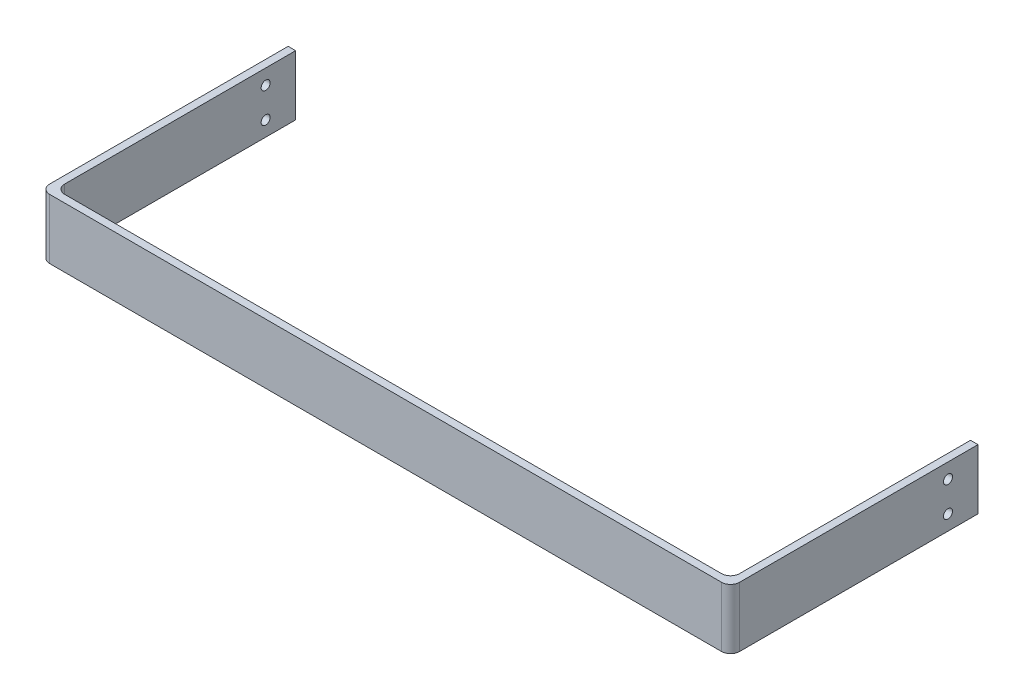
ISO-10303-21;
HEADER;
FILE_DESCRIPTION(('STEP AP214'),'2;1');
FILE_NAME('part.step','',(''),(''),'','','');
FILE_SCHEMA(('AUTOMOTIVE_DESIGN { 1 0 10303 214 1 1 1 1 }'));
ENDSEC;
DATA;
#1=APPLICATION_CONTEXT('core data for automotive mechanical design processes');
#2=APPLICATION_PROTOCOL_DEFINITION('international standard','automotive_design',2000,#1);
#3=PRODUCT_CONTEXT('',#1,'mechanical');
#4=PRODUCT('Part','Part','',(#3));
#5=PRODUCT_RELATED_PRODUCT_CATEGORY('part','',(#4));
#6=PRODUCT_DEFINITION_FORMATION('','',#4);
#7=PRODUCT_DEFINITION_CONTEXT('part definition',#1,'design');
#8=PRODUCT_DEFINITION('design','',#6,#7);
#9=PRODUCT_DEFINITION_SHAPE('','',#8);
#10=(LENGTH_UNIT() NAMED_UNIT(*) SI_UNIT(.MILLI.,.METRE.));
#11=(NAMED_UNIT(*) PLANE_ANGLE_UNIT() SI_UNIT($,.RADIAN.));
#12=(NAMED_UNIT(*) SI_UNIT($,.STERADIAN.) SOLID_ANGLE_UNIT());
#13=UNCERTAINTY_MEASURE_WITH_UNIT(LENGTH_MEASURE(1.E-05),#10,'distance_accuracy_value','');
#14=(GEOMETRIC_REPRESENTATION_CONTEXT(3) GLOBAL_UNCERTAINTY_ASSIGNED_CONTEXT((#13)) GLOBAL_UNIT_ASSIGNED_CONTEXT((#10,
#11,#12)) REPRESENTATION_CONTEXT('',''));
#15=CARTESIAN_POINT('',(0.,0.,0.));
#16=DIRECTION('',(0.,0.,1.));
#17=DIRECTION('',(1.,0.,0.));
#18=AXIS2_PLACEMENT_3D('',#15,#16,#17);
#19=CARTESIAN_POINT('',(227.5,20.,0.));
#20=DIRECTION('',(-1.,0.,0.));
#21=DIRECTION('',(0.,0.,1.));
#22=AXIS2_PLACEMENT_3D('',#19,#20,#21);
#23=PLANE('',#22);
#24=CARTESIAN_POINT('',(227.5,15.,-70.));
#25=DIRECTION('',(-1.,0.,0.));
#26=DIRECTION('',(0.,0.,1.));
#27=AXIS2_PLACEMENT_3D('',#24,#25,#26);
#28=CIRCLE('',#27,1.5);
#29=CARTESIAN_POINT('',(227.5,15.,-68.5));
#30=VERTEX_POINT('',#29);
#31=EDGE_CURVE('E171',#30,#30,#28,.F.);
#32=ORIENTED_EDGE('',*,*,#31,.F.);
#33=EDGE_LOOP('',(#32));
#34=FACE_BOUND('',#33,.T.);
#35=DIRECTION('',(0.,0.,-1.));
#36=VECTOR('',#35,1.);
#37=CARTESIAN_POINT('',(227.5,20.,0.));
#38=LINE('',#37,#36);
#39=CARTESIAN_POINT('',(227.5,20.,-0.5));
#40=VERTEX_POINT('',#39);
#41=CARTESIAN_POINT('',(227.5,20.,-80.));
#42=VERTEX_POINT('',#41);
#43=EDGE_CURVE('E123',#40,#42,#38,.T.);
#44=ORIENTED_EDGE('',*,*,#43,.F.);
#45=DIRECTION('',(0.,-1.,0.));
#46=VECTOR('',#45,1.);
#47=CARTESIAN_POINT('',(227.5,20.,-0.5));
#48=LINE('',#47,#46);
#49=CARTESIAN_POINT('',(227.5,0.,-0.5));
#50=VERTEX_POINT('',#49);
#51=EDGE_CURVE('E198',#40,#50,#48,.T.);
#52=ORIENTED_EDGE('',*,*,#51,.T.);
#53=DIRECTION('',(0.,0.,-1.));
#54=VECTOR('',#53,1.);
#55=CARTESIAN_POINT('',(227.5,0.,0.));
#56=LINE('',#55,#54);
#57=CARTESIAN_POINT('',(227.5,0.,-80.));
#58=VERTEX_POINT('',#57);
#59=EDGE_CURVE('E141',#50,#58,#56,.T.);
#60=ORIENTED_EDGE('',*,*,#59,.T.);
#61=DIRECTION('',(0.,-1.,0.));
#62=VECTOR('',#61,1.);
#63=CARTESIAN_POINT('',(227.5,20.,-80.));
#64=LINE('',#63,#62);
#65=EDGE_CURVE('E138',#42,#58,#64,.T.);
#66=ORIENTED_EDGE('',*,*,#65,.F.);
#67=EDGE_LOOP('',(#44,#52,#60,#66));
#68=FACE_BOUND('',#67,.T.);
#69=CARTESIAN_POINT('',(227.5,5.,-70.));
#70=DIRECTION('',(-1.,0.,0.));
#71=DIRECTION('',(0.,0.,1.));
#72=AXIS2_PLACEMENT_3D('',#69,#70,#71);
#73=CIRCLE('',#72,1.5);
#74=CARTESIAN_POINT('',(227.5,5.,-68.5));
#75=VERTEX_POINT('',#74);
#76=EDGE_CURVE('E316',#75,#75,#73,.F.);
#77=ORIENTED_EDGE('',*,*,#76,.F.);
#78=EDGE_LOOP('',(#77));
#79=FACE_BOUND('',#78,.T.);
#80=ADVANCED_FACE('F33',(#34,#68,#79),#23,.F.);
#81=CARTESIAN_POINT('',(225.,20.,0.));
#82=DIRECTION('',(-1.,0.,0.));
#83=DIRECTION('',(0.,0.,1.));
#84=AXIS2_PLACEMENT_3D('',#81,#82,#83);
#85=PLANE('',#84);
#86=CARTESIAN_POINT('',(225.,15.,-70.));
#87=DIRECTION('',(-1.,0.,0.));
#88=DIRECTION('',(0.,0.,1.));
#89=AXIS2_PLACEMENT_3D('',#86,#87,#88);
#90=CIRCLE('',#89,1.5);
#91=CARTESIAN_POINT('',(225.,15.,-68.5));
#92=VERTEX_POINT('',#91);
#93=EDGE_CURVE('E325',#92,#92,#90,.F.);
#94=ORIENTED_EDGE('',*,*,#93,.T.);
#95=EDGE_LOOP('',(#94));
#96=FACE_BOUND('',#95,.T.);
#97=DIRECTION('',(0.,0.,-1.));
#98=VECTOR('',#97,1.);
#99=CARTESIAN_POINT('',(225.,0.,0.));
#100=LINE('',#99,#98);
#101=CARTESIAN_POINT('',(225.,0.,-3.));
#102=VERTEX_POINT('',#101);
#103=CARTESIAN_POINT('',(225.,0.,-80.));
#104=VERTEX_POINT('',#103);
#105=EDGE_CURVE('E173',#102,#104,#100,.T.);
#106=ORIENTED_EDGE('',*,*,#105,.F.);
#107=DIRECTION('',(0.,-1.,0.));
#108=VECTOR('',#107,1.);
#109=CARTESIAN_POINT('',(225.,20.,-3.));
#110=LINE('',#109,#108);
#111=CARTESIAN_POINT('',(225.,20.,-3.));
#112=VERTEX_POINT('',#111);
#113=EDGE_CURVE('E196',#102,#112,#110,.F.);
#114=ORIENTED_EDGE('',*,*,#113,.T.);
#115=DIRECTION('',(0.,0.,-1.));
#116=VECTOR('',#115,1.);
#117=CARTESIAN_POINT('',(225.,20.,0.));
#118=LINE('',#117,#116);
#119=CARTESIAN_POINT('',(225.,20.,-80.));
#120=VERTEX_POINT('',#119);
#121=EDGE_CURVE('E151',#112,#120,#118,.T.);
#122=ORIENTED_EDGE('',*,*,#121,.T.);
#123=DIRECTION('',(0.,-1.,0.));
#124=VECTOR('',#123,1.);
#125=CARTESIAN_POINT('',(225.,20.,-80.));
#126=LINE('',#125,#124);
#127=EDGE_CURVE('E146',#120,#104,#126,.T.);
#128=ORIENTED_EDGE('',*,*,#127,.T.);
#129=EDGE_LOOP('',(#106,#114,#122,#128));
#130=FACE_BOUND('',#129,.T.);
#131=CARTESIAN_POINT('',(225.,5.,-70.));
#132=DIRECTION('',(-1.,0.,0.));
#133=DIRECTION('',(0.,0.,1.));
#134=AXIS2_PLACEMENT_3D('',#131,#132,#133);
#135=CIRCLE('',#134,1.5);
#136=CARTESIAN_POINT('',(225.,5.,-68.5));
#137=VERTEX_POINT('',#136);
#138=EDGE_CURVE('E311',#137,#137,#135,.F.);
#139=ORIENTED_EDGE('',*,*,#138,.T.);
#140=EDGE_LOOP('',(#139));
#141=FACE_BOUND('',#140,.T.);
#142=ADVANCED_FACE('F260',(#96,#130,#141),#85,.T.);
#143=CARTESIAN_POINT('',(0.,20.,-80.));
#144=DIRECTION('',(1.,0.,0.));
#145=DIRECTION('',(0.,0.,-1.));
#146=AXIS2_PLACEMENT_3D('',#143,#144,#145);
#147=PLANE('',#146);
#148=CARTESIAN_POINT('',(0.,15.,-70.));
#149=DIRECTION('',(1.,0.,0.));
#150=DIRECTION('',(0.,0.,-1.));
#151=AXIS2_PLACEMENT_3D('',#148,#149,#150);
#152=CIRCLE('',#151,1.5);
#153=CARTESIAN_POINT('',(0.,15.,-71.5));
#154=VERTEX_POINT('',#153);
#155=EDGE_CURVE('E322',#154,#154,#152,.F.);
#156=ORIENTED_EDGE('',*,*,#155,.T.);
#157=EDGE_LOOP('',(#156));
#158=FACE_BOUND('',#157,.T.);
#159=DIRECTION('',(0.,0.,1.));
#160=VECTOR('',#159,1.);
#161=CARTESIAN_POINT('',(0.,20.,-80.));
#162=LINE('',#161,#160);
#163=CARTESIAN_POINT('',(0.,20.,-80.));
#164=VERTEX_POINT('',#163);
#165=CARTESIAN_POINT('',(0.,20.,-3.));
#166=VERTEX_POINT('',#165);
#167=EDGE_CURVE('E159',#164,#166,#162,.T.);
#168=ORIENTED_EDGE('',*,*,#167,.T.);
#169=DIRECTION('',(0.,-1.,0.));
#170=VECTOR('',#169,1.);
#171=CARTESIAN_POINT('',(0.,0.,-3.));
#172=LINE('',#171,#170);
#173=CARTESIAN_POINT('',(0.,0.,-3.));
#174=VERTEX_POINT('',#173);
#175=EDGE_CURVE('E212',#166,#174,#172,.T.);
#176=ORIENTED_EDGE('',*,*,#175,.T.);
#177=DIRECTION('',(0.,0.,1.));
#178=VECTOR('',#177,1.);
#179=CARTESIAN_POINT('',(0.,0.,-80.));
#180=LINE('',#179,#178);
#181=CARTESIAN_POINT('',(0.,0.,-80.));
#182=VERTEX_POINT('',#181);
#183=EDGE_CURVE('E178',#182,#174,#180,.T.);
#184=ORIENTED_EDGE('',*,*,#183,.F.);
#185=DIRECTION('',(0.,-1.,0.));
#186=VECTOR('',#185,1.);
#187=CARTESIAN_POINT('',(0.,20.,-80.));
#188=LINE('',#187,#186);
#189=EDGE_CURVE('E189',#164,#182,#188,.T.);
#190=ORIENTED_EDGE('',*,*,#189,.F.);
#191=EDGE_LOOP('',(#168,#176,#184,#190));
#192=FACE_BOUND('',#191,.T.);
#193=CARTESIAN_POINT('',(0.,5.,-70.));
#194=DIRECTION('',(1.,0.,0.));
#195=DIRECTION('',(0.,0.,-1.));
#196=AXIS2_PLACEMENT_3D('',#193,#194,#195);
#197=CIRCLE('',#196,1.5);
#198=CARTESIAN_POINT('',(0.,5.,-71.5));
#199=VERTEX_POINT('',#198);
#200=EDGE_CURVE('E306',#199,#199,#197,.F.);
#201=ORIENTED_EDGE('',*,*,#200,.T.);
#202=EDGE_LOOP('',(#201));
#203=FACE_BOUND('',#202,.T.);
#204=ADVANCED_FACE('F231',(#158,#192,#203),#147,.T.);
#205=CARTESIAN_POINT('',(-2.5,20.,-80.));
#206=DIRECTION('',(1.,0.,0.));
#207=DIRECTION('',(0.,0.,-1.));
#208=AXIS2_PLACEMENT_3D('',#205,#206,#207);
#209=PLANE('',#208);
#210=CARTESIAN_POINT('',(-2.5,15.,-70.));
#211=DIRECTION('',(1.,0.,0.));
#212=DIRECTION('',(0.,0.,-1.));
#213=AXIS2_PLACEMENT_3D('',#210,#211,#212);
#214=CIRCLE('',#213,1.5);
#215=CARTESIAN_POINT('',(-2.5,15.,-71.5));
#216=VERTEX_POINT('',#215);
#217=EDGE_CURVE('E319',#216,#216,#214,.T.);
#218=ORIENTED_EDGE('',*,*,#217,.T.);
#219=EDGE_LOOP('',(#218));
#220=FACE_BOUND('',#219,.T.);
#221=DIRECTION('',(0.,0.,-1.));
#222=VECTOR('',#221,1.);
#223=CARTESIAN_POINT('',(-2.5,0.,-80.));
#224=LINE('',#223,#222);
#225=CARTESIAN_POINT('',(-2.5,0.,-80.));
#226=VERTEX_POINT('',#225);
#227=CARTESIAN_POINT('',(-2.5,0.,-0.5));
#228=VERTEX_POINT('',#227);
#229=EDGE_CURVE('E184',#226,#228,#224,.F.);
#230=ORIENTED_EDGE('',*,*,#229,.T.);
#231=DIRECTION('',(0.,-1.,0.));
#232=VECTOR('',#231,1.);
#233=CARTESIAN_POINT('',(-2.5,20.,-0.5));
#234=LINE('',#233,#232);
#235=CARTESIAN_POINT('',(-2.5,20.,-0.5));
#236=VERTEX_POINT('',#235);
#237=EDGE_CURVE('E48',#228,#236,#234,.F.);
#238=ORIENTED_EDGE('',*,*,#237,.T.);
#239=DIRECTION('',(0.,0.,-1.));
#240=VECTOR('',#239,1.);
#241=CARTESIAN_POINT('',(-2.5,20.,-80.));
#242=LINE('',#241,#240);
#243=CARTESIAN_POINT('',(-2.5,20.,-80.));
#244=VERTEX_POINT('',#243);
#245=EDGE_CURVE('E164',#244,#236,#242,.F.);
#246=ORIENTED_EDGE('',*,*,#245,.F.);
#247=DIRECTION('',(0.,-1.,0.));
#248=VECTOR('',#247,1.);
#249=CARTESIAN_POINT('',(-2.5,20.,-80.));
#250=LINE('',#249,#248);
#251=EDGE_CURVE('E168',#244,#226,#250,.T.);
#252=ORIENTED_EDGE('',*,*,#251,.T.);
#253=EDGE_LOOP('',(#230,#238,#246,#252));
#254=FACE_BOUND('',#253,.T.);
#255=CARTESIAN_POINT('',(-2.5,5.,-70.));
#256=DIRECTION('',(1.,0.,0.));
#257=DIRECTION('',(0.,0.,-1.));
#258=AXIS2_PLACEMENT_3D('',#255,#256,#257);
#259=CIRCLE('',#258,1.5);
#260=CARTESIAN_POINT('',(-2.5,5.,-71.5));
#261=VERTEX_POINT('',#260);
#262=EDGE_CURVE('E309',#261,#261,#259,.T.);
#263=ORIENTED_EDGE('',*,*,#262,.T.);
#264=EDGE_LOOP('',(#263));
#265=FACE_BOUND('',#264,.T.);
#266=ADVANCED_FACE('F238',(#220,#254,#265),#209,.F.);
#267=CARTESIAN_POINT('',(225.,20.,-80.));
#268=DIRECTION('',(0.,0.,-1.));
#269=DIRECTION('',(-1.,0.,0.));
#270=AXIS2_PLACEMENT_3D('',#267,#268,#269);
#271=PLANE('',#270);
#272=DIRECTION('',(1.,0.,0.));
#273=VECTOR('',#272,1.);
#274=CARTESIAN_POINT('',(225.,0.,-80.));
#275=LINE('',#274,#273);
#276=EDGE_CURVE('E170',#104,#58,#275,.T.);
#277=ORIENTED_EDGE('',*,*,#276,.F.);
#278=ORIENTED_EDGE('',*,*,#127,.F.);
#279=DIRECTION('',(1.,0.,0.));
#280=VECTOR('',#279,1.);
#281=CARTESIAN_POINT('',(225.,20.,-80.));
#282=LINE('',#281,#280);
#283=EDGE_CURVE('E129',#120,#42,#282,.T.);
#284=ORIENTED_EDGE('',*,*,#283,.T.);
#285=ORIENTED_EDGE('',*,*,#65,.T.);
#286=EDGE_LOOP('',(#277,#278,#284,#285));
#287=FACE_BOUND('',#286,.T.);
#288=ADVANCED_FACE('F149',(#287),#271,.T.);
#289=CARTESIAN_POINT('',(0.,20.,0.));
#290=DIRECTION('',(0.,0.,-1.));
#291=DIRECTION('',(-1.,0.,0.));
#292=AXIS2_PLACEMENT_3D('',#289,#290,#291);
#293=PLANE('',#292);
#294=DIRECTION('',(1.,0.,0.));
#295=VECTOR('',#294,1.);
#296=CARTESIAN_POINT('',(0.,20.,0.));
#297=LINE('',#296,#295);
#298=CARTESIAN_POINT('',(3.,20.,0.));
#299=VERTEX_POINT('',#298);
#300=CARTESIAN_POINT('',(222.,20.,0.));
#301=VERTEX_POINT('',#300);
#302=EDGE_CURVE('E153',#299,#301,#297,.T.);
#303=ORIENTED_EDGE('',*,*,#302,.T.);
#304=DIRECTION('',(0.,-1.,0.));
#305=VECTOR('',#304,1.);
#306=CARTESIAN_POINT('',(222.,0.,0.));
#307=LINE('',#306,#305);
#308=CARTESIAN_POINT('',(222.,0.,0.));
#309=VERTEX_POINT('',#308);
#310=EDGE_CURVE('E193',#301,#309,#307,.T.);
#311=ORIENTED_EDGE('',*,*,#310,.T.);
#312=DIRECTION('',(1.,0.,0.));
#313=VECTOR('',#312,1.);
#314=CARTESIAN_POINT('',(0.,0.,0.));
#315=LINE('',#314,#313);
#316=CARTESIAN_POINT('',(3.,0.,0.));
#317=VERTEX_POINT('',#316);
#318=EDGE_CURVE('E175',#317,#309,#315,.T.);
#319=ORIENTED_EDGE('',*,*,#318,.F.);
#320=DIRECTION('',(0.,-1.,0.));
#321=VECTOR('',#320,1.);
#322=CARTESIAN_POINT('',(3.,20.,0.));
#323=LINE('',#322,#321);
#324=EDGE_CURVE('E145',#317,#299,#323,.F.);
#325=ORIENTED_EDGE('',*,*,#324,.T.);
#326=EDGE_LOOP('',(#303,#311,#319,#325));
#327=FACE_BOUND('',#326,.T.);
#328=ADVANCED_FACE('F227',(#327),#293,.T.);
#329=CARTESIAN_POINT('',(-2.5,20.,-80.));
#330=DIRECTION('',(0.,0.,-1.));
#331=DIRECTION('',(-1.,0.,0.));
#332=AXIS2_PLACEMENT_3D('',#329,#330,#331);
#333=PLANE('',#332);
#334=DIRECTION('',(1.,0.,0.));
#335=VECTOR('',#334,1.);
#336=CARTESIAN_POINT('',(-2.5,0.,-80.));
#337=LINE('',#336,#335);
#338=EDGE_CURVE('E181',#226,#182,#337,.T.);
#339=ORIENTED_EDGE('',*,*,#338,.F.);
#340=ORIENTED_EDGE('',*,*,#251,.F.);
#341=DIRECTION('',(1.,0.,0.));
#342=VECTOR('',#341,1.);
#343=CARTESIAN_POINT('',(-2.5,20.,-80.));
#344=LINE('',#343,#342);
#345=EDGE_CURVE('E161',#244,#164,#344,.T.);
#346=ORIENTED_EDGE('',*,*,#345,.T.);
#347=ORIENTED_EDGE('',*,*,#189,.T.);
#348=EDGE_LOOP('',(#339,#340,#346,#347));
#349=FACE_BOUND('',#348,.T.);
#350=ADVANCED_FACE('F236',(#349),#333,.T.);
#351=CARTESIAN_POINT('',(0.,20.,2.5));
#352=DIRECTION('',(0.,0.,-1.));
#353=DIRECTION('',(-1.,0.,0.));
#354=AXIS2_PLACEMENT_3D('',#351,#352,#353);
#355=PLANE('',#354);
#356=DIRECTION('',(1.,0.,0.));
#357=VECTOR('',#356,1.);
#358=CARTESIAN_POINT('',(0.,0.,2.5));
#359=LINE('',#358,#357);
#360=CARTESIAN_POINT('',(0.5,0.,2.5));
#361=VERTEX_POINT('',#360);
#362=CARTESIAN_POINT('',(224.5,0.,2.5));
#363=VERTEX_POINT('',#362);
#364=EDGE_CURVE('E135',#361,#363,#359,.T.);
#365=ORIENTED_EDGE('',*,*,#364,.T.);
#366=DIRECTION('',(0.,-1.,0.));
#367=VECTOR('',#366,1.);
#368=CARTESIAN_POINT('',(224.5,20.,2.5));
#369=LINE('',#368,#367);
#370=CARTESIAN_POINT('',(224.5,20.,2.5));
#371=VERTEX_POINT('',#370);
#372=EDGE_CURVE('E207',#363,#371,#369,.F.);
#373=ORIENTED_EDGE('',*,*,#372,.T.);
#374=DIRECTION('',(1.,0.,0.));
#375=VECTOR('',#374,1.);
#376=CARTESIAN_POINT('',(0.,20.,2.5));
#377=LINE('',#376,#375);
#378=CARTESIAN_POINT('',(0.5,20.,2.5));
#379=VERTEX_POINT('',#378);
#380=EDGE_CURVE('E166',#379,#371,#377,.T.);
#381=ORIENTED_EDGE('',*,*,#380,.F.);
#382=DIRECTION('',(0.,-1.,0.));
#383=VECTOR('',#382,1.);
#384=CARTESIAN_POINT('',(0.5,20.,2.5));
#385=LINE('',#384,#383);
#386=EDGE_CURVE('E204',#379,#361,#385,.T.);
#387=ORIENTED_EDGE('',*,*,#386,.T.);
#388=EDGE_LOOP('',(#365,#373,#381,#387));
#389=FACE_BOUND('',#388,.T.);
#390=ADVANCED_FACE('F246',(#389),#355,.F.);
#391=CARTESIAN_POINT('',(0.,20.,0.));
#392=DIRECTION('',(0.,-1.,0.));
#393=DIRECTION('',(-1.,0.,0.));
#394=AXIS2_PLACEMENT_3D('',#391,#392,#393);
#395=PLANE('',#394);
#396=ORIENTED_EDGE('',*,*,#380,.T.);
#397=CARTESIAN_POINT('',(224.5,20.,-0.5));
#398=DIRECTION('',(0.,-1.,0.));
#399=DIRECTION('',(0.,0.,-1.));
#400=AXIS2_PLACEMENT_3D('',#397,#398,#399);
#401=CIRCLE('',#400,3.);
#402=EDGE_CURVE('E131',#371,#40,#401,.F.);
#403=ORIENTED_EDGE('',*,*,#402,.T.);
#404=ORIENTED_EDGE('',*,*,#43,.T.);
#405=ORIENTED_EDGE('',*,*,#283,.F.);
#406=ORIENTED_EDGE('',*,*,#121,.F.);
#407=CARTESIAN_POINT('',(222.,20.,-3.));
#408=DIRECTION('',(0.,-1.,0.));
#409=DIRECTION('',(0.,0.,-1.));
#410=AXIS2_PLACEMENT_3D('',#407,#408,#409);
#411=CIRCLE('',#410,3.);
#412=EDGE_CURVE('E218',#112,#301,#411,.T.);
#413=ORIENTED_EDGE('',*,*,#412,.T.);
#414=ORIENTED_EDGE('',*,*,#302,.F.);
#415=CARTESIAN_POINT('',(3.,20.,-3.));
#416=DIRECTION('',(0.,-1.,0.));
#417=DIRECTION('',(0.,0.,-1.));
#418=AXIS2_PLACEMENT_3D('',#415,#416,#417);
#419=CIRCLE('',#418,3.);
#420=EDGE_CURVE('E11',#299,#166,#419,.T.);
#421=ORIENTED_EDGE('',*,*,#420,.T.);
#422=ORIENTED_EDGE('',*,*,#167,.F.);
#423=ORIENTED_EDGE('',*,*,#345,.F.);
#424=ORIENTED_EDGE('',*,*,#245,.T.);
#425=CARTESIAN_POINT('',(0.5,20.,-0.5));
#426=DIRECTION('',(0.,-1.,0.));
#427=DIRECTION('',(0.,0.,-1.));
#428=AXIS2_PLACEMENT_3D('',#425,#426,#427);
#429=CIRCLE('',#428,3.);
#430=EDGE_CURVE('E209',#236,#379,#429,.F.);
#431=ORIENTED_EDGE('',*,*,#430,.T.);
#432=EDGE_LOOP('',(#396,#403,#404,#405,#406,#413,#414,#421,#422,#423,#424,#431));
#433=FACE_BOUND('',#432,.T.);
#434=ADVANCED_FACE('F126',(#433),#395,.F.);
#435=CARTESIAN_POINT('',(0.,0.,0.));
#436=DIRECTION('',(0.,-1.,0.));
#437=DIRECTION('',(-1.,0.,0.));
#438=AXIS2_PLACEMENT_3D('',#435,#436,#437);
#439=PLANE('',#438);
#440=ORIENTED_EDGE('',*,*,#59,.F.);
#441=CARTESIAN_POINT('',(224.5,0.,-0.5));
#442=DIRECTION('',(0.,-1.,0.));
#443=DIRECTION('',(0.,0.,-1.));
#444=AXIS2_PLACEMENT_3D('',#441,#442,#443);
#445=CIRCLE('',#444,3.);
#446=EDGE_CURVE('E202',#50,#363,#445,.T.);
#447=ORIENTED_EDGE('',*,*,#446,.T.);
#448=ORIENTED_EDGE('',*,*,#364,.F.);
#449=CARTESIAN_POINT('',(0.5,0.,-0.5));
#450=DIRECTION('',(0.,-1.,0.));
#451=DIRECTION('',(0.,0.,-1.));
#452=AXIS2_PLACEMENT_3D('',#449,#450,#451);
#453=CIRCLE('',#452,3.);
#454=EDGE_CURVE('E200',#361,#228,#453,.T.);
#455=ORIENTED_EDGE('',*,*,#454,.T.);
#456=ORIENTED_EDGE('',*,*,#229,.F.);
#457=ORIENTED_EDGE('',*,*,#338,.T.);
#458=ORIENTED_EDGE('',*,*,#183,.T.);
#459=CARTESIAN_POINT('',(3.,0.,-3.));
#460=DIRECTION('',(0.,-1.,0.));
#461=DIRECTION('',(0.,0.,-1.));
#462=AXIS2_PLACEMENT_3D('',#459,#460,#461);
#463=CIRCLE('',#462,3.);
#464=EDGE_CURVE('E41',#174,#317,#463,.F.);
#465=ORIENTED_EDGE('',*,*,#464,.T.);
#466=ORIENTED_EDGE('',*,*,#318,.T.);
#467=CARTESIAN_POINT('',(222.,0.,-3.));
#468=DIRECTION('',(0.,-1.,0.));
#469=DIRECTION('',(0.,0.,-1.));
#470=AXIS2_PLACEMENT_3D('',#467,#468,#469);
#471=CIRCLE('',#470,3.);
#472=EDGE_CURVE('E216',#309,#102,#471,.F.);
#473=ORIENTED_EDGE('',*,*,#472,.T.);
#474=ORIENTED_EDGE('',*,*,#105,.T.);
#475=ORIENTED_EDGE('',*,*,#276,.T.);
#476=EDGE_LOOP('',(#440,#447,#448,#455,#456,#457,#458,#465,#466,#473,#474,#475));
#477=FACE_BOUND('',#476,.T.);
#478=ADVANCED_FACE('F221',(#477),#439,.T.);
#479=CARTESIAN_POINT('',(222.,20.,-3.));
#480=DIRECTION('',(0.,1.,0.));
#481=DIRECTION('',(0.,0.,1.));
#482=AXIS2_PLACEMENT_3D('',#479,#480,#481);
#483=CYLINDRICAL_SURFACE('',#482,3.);
#484=ORIENTED_EDGE('',*,*,#412,.F.);
#485=ORIENTED_EDGE('',*,*,#113,.F.);
#486=ORIENTED_EDGE('',*,*,#472,.F.);
#487=ORIENTED_EDGE('',*,*,#310,.F.);
#488=EDGE_LOOP('',(#484,#485,#486,#487));
#489=FACE_BOUND('',#488,.T.);
#490=ADVANCED_FACE('F251',(#489),#483,.F.);
#491=CARTESIAN_POINT('',(224.5,20.,-0.5));
#492=DIRECTION('',(0.,-1.,0.));
#493=DIRECTION('',(0.,0.,-1.));
#494=AXIS2_PLACEMENT_3D('',#491,#492,#493);
#495=CYLINDRICAL_SURFACE('',#494,3.);
#496=ORIENTED_EDGE('',*,*,#402,.F.);
#497=ORIENTED_EDGE('',*,*,#372,.F.);
#498=ORIENTED_EDGE('',*,*,#446,.F.);
#499=ORIENTED_EDGE('',*,*,#51,.F.);
#500=EDGE_LOOP('',(#496,#497,#498,#499));
#501=FACE_BOUND('',#500,.T.);
#502=ADVANCED_FACE('F249',(#501),#495,.T.);
#503=CARTESIAN_POINT('',(3.,20.,-3.));
#504=DIRECTION('',(0.,1.,0.));
#505=DIRECTION('',(0.,0.,1.));
#506=AXIS2_PLACEMENT_3D('',#503,#504,#505);
#507=CYLINDRICAL_SURFACE('',#506,3.);
#508=ORIENTED_EDGE('',*,*,#420,.F.);
#509=ORIENTED_EDGE('',*,*,#324,.F.);
#510=ORIENTED_EDGE('',*,*,#464,.F.);
#511=ORIENTED_EDGE('',*,*,#175,.F.);
#512=EDGE_LOOP('',(#508,#509,#510,#511));
#513=FACE_BOUND('',#512,.T.);
#514=ADVANCED_FACE('F229',(#513),#507,.F.);
#515=CARTESIAN_POINT('',(0.5,20.,-0.5));
#516=DIRECTION('',(0.,-1.,0.));
#517=DIRECTION('',(0.,0.,-1.));
#518=AXIS2_PLACEMENT_3D('',#515,#516,#517);
#519=CYLINDRICAL_SURFACE('',#518,3.);
#520=ORIENTED_EDGE('',*,*,#430,.F.);
#521=ORIENTED_EDGE('',*,*,#237,.F.);
#522=ORIENTED_EDGE('',*,*,#454,.F.);
#523=ORIENTED_EDGE('',*,*,#386,.F.);
#524=EDGE_LOOP('',(#520,#521,#522,#523));
#525=FACE_BOUND('',#524,.T.);
#526=ADVANCED_FACE('F35',(#525),#519,.T.);
#527=CARTESIAN_POINT('',(267.5,15.,-70.));
#528=DIRECTION('',(-1.,0.,0.));
#529=DIRECTION('',(0.,0.,1.));
#530=AXIS2_PLACEMENT_3D('',#527,#528,#529);
#531=CYLINDRICAL_SURFACE('',#530,1.5);
#532=ORIENTED_EDGE('',*,*,#155,.F.);
#533=EDGE_LOOP('',(#532));
#534=FACE_BOUND('',#533,.T.);
#535=ORIENTED_EDGE('',*,*,#217,.F.);
#536=EDGE_LOOP('',(#535));
#537=FACE_BOUND('',#536,.T.);
#538=ADVANCED_FACE('F288',(#534,#537),#531,.F.);
#539=ORIENTED_EDGE('',*,*,#93,.F.);
#540=EDGE_LOOP('',(#539));
#541=FACE_BOUND('',#540,.T.);
#542=ORIENTED_EDGE('',*,*,#31,.T.);
#543=EDGE_LOOP('',(#542));
#544=FACE_BOUND('',#543,.T.);
#545=ADVANCED_FACE('F291',(#541,#544),#531,.F.);
#546=CARTESIAN_POINT('',(267.5,5.,-70.));
#547=DIRECTION('',(-1.,0.,0.));
#548=DIRECTION('',(0.,0.,1.));
#549=AXIS2_PLACEMENT_3D('',#546,#547,#548);
#550=CYLINDRICAL_SURFACE('',#549,1.5);
#551=ORIENTED_EDGE('',*,*,#200,.F.);
#552=EDGE_LOOP('',(#551));
#553=FACE_BOUND('',#552,.T.);
#554=ORIENTED_EDGE('',*,*,#262,.F.);
#555=EDGE_LOOP('',(#554));
#556=FACE_BOUND('',#555,.T.);
#557=ADVANCED_FACE('F293',(#553,#556),#550,.F.);
#558=ORIENTED_EDGE('',*,*,#138,.F.);
#559=EDGE_LOOP('',(#558));
#560=FACE_BOUND('',#559,.T.);
#561=ORIENTED_EDGE('',*,*,#76,.T.);
#562=EDGE_LOOP('',(#561));
#563=FACE_BOUND('',#562,.T.);
#564=ADVANCED_FACE('F295',(#560,#563),#550,.F.);
#565=CLOSED_SHELL('',(#80,#142,#204,#266,#288,#328,#350,#390,#434,#478,#490,#502,#514,#526,#538,
#545,#557,#564));
#566=MANIFOLD_SOLID_BREP('B2',#565);
#567=ADVANCED_BREP_SHAPE_REPRESENTATION('',(#18,#566),#14);
#568=SHAPE_DEFINITION_REPRESENTATION(#9,#567);
ENDSEC;
END-ISO-10303-21;
